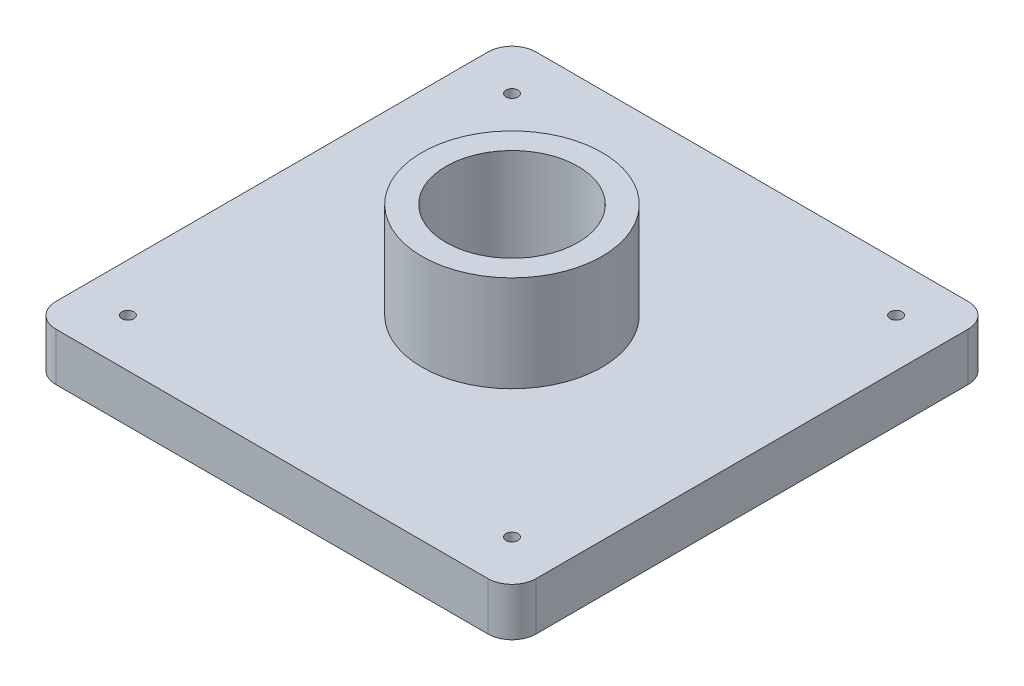
ISO-10303-21;
HEADER;
FILE_DESCRIPTION(('STEP AP214'),'2;1');
FILE_NAME('part.step','',(''),(''),'','','');
FILE_SCHEMA(('AUTOMOTIVE_DESIGN { 1 0 10303 214 1 1 1 1 }'));
ENDSEC;
DATA;
#1=APPLICATION_CONTEXT('core data for automotive mechanical design processes');
#2=APPLICATION_PROTOCOL_DEFINITION('international standard','automotive_design',2000,#1);
#3=PRODUCT_CONTEXT('',#1,'mechanical');
#4=PRODUCT('Part','Part','',(#3));
#5=PRODUCT_RELATED_PRODUCT_CATEGORY('part','',(#4));
#6=PRODUCT_DEFINITION_FORMATION('','',#4);
#7=PRODUCT_DEFINITION_CONTEXT('part definition',#1,'design');
#8=PRODUCT_DEFINITION('design','',#6,#7);
#9=PRODUCT_DEFINITION_SHAPE('','',#8);
#10=(LENGTH_UNIT() NAMED_UNIT(*) SI_UNIT(.MILLI.,.METRE.));
#11=(NAMED_UNIT(*) PLANE_ANGLE_UNIT() SI_UNIT($,.RADIAN.));
#12=(NAMED_UNIT(*) SI_UNIT($,.STERADIAN.) SOLID_ANGLE_UNIT());
#13=UNCERTAINTY_MEASURE_WITH_UNIT(LENGTH_MEASURE(1.E-05),#10,'distance_accuracy_value','');
#14=(GEOMETRIC_REPRESENTATION_CONTEXT(3) GLOBAL_UNCERTAINTY_ASSIGNED_CONTEXT((#13)) GLOBAL_UNIT_ASSIGNED_CONTEXT((#10,
#11,#12)) REPRESENTATION_CONTEXT('',''));
#15=CARTESIAN_POINT('',(0.,0.,0.));
#16=DIRECTION('',(0.,0.,1.));
#17=DIRECTION('',(1.,0.,0.));
#18=AXIS2_PLACEMENT_3D('',#15,#16,#17);
#19=CARTESIAN_POINT('',(-90.,20.,90.));
#20=DIRECTION('',(0.,-1.,0.));
#21=DIRECTION('',(0.,0.,-1.));
#22=AXIS2_PLACEMENT_3D('',#19,#20,#21);
#23=CYLINDRICAL_SURFACE('',#22,9.99999999999999);
#24=CARTESIAN_POINT('',(-90.,0.,90.));
#25=DIRECTION('',(0.,1.,0.));
#26=DIRECTION('',(0.,0.,-1.));
#27=AXIS2_PLACEMENT_3D('',#24,#25,#26);
#28=CIRCLE('',#27,9.99999999999999);
#29=CARTESIAN_POINT('',(-100.,0.,90.));
#30=VERTEX_POINT('',#29);
#31=CARTESIAN_POINT('',(-90.,0.,100.));
#32=VERTEX_POINT('',#31);
#33=EDGE_CURVE('E150',#30,#32,#28,.T.);
#34=ORIENTED_EDGE('',*,*,#33,.T.);
#35=DIRECTION('',(0.,-1.,0.));
#36=VECTOR('',#35,1.);
#37=CARTESIAN_POINT('',(-90.,20.,100.));
#38=LINE('',#37,#36);
#39=CARTESIAN_POINT('',(-90.,20.,100.));
#40=VERTEX_POINT('',#39);
#41=EDGE_CURVE('E51',#40,#32,#38,.T.);
#42=ORIENTED_EDGE('',*,*,#41,.F.);
#43=CARTESIAN_POINT('',(-90.,20.,90.));
#44=DIRECTION('',(0.,1.,0.));
#45=DIRECTION('',(0.,0.,-1.));
#46=AXIS2_PLACEMENT_3D('',#43,#44,#45);
#47=CIRCLE('',#46,9.99999999999999);
#48=CARTESIAN_POINT('',(-100.,20.,90.));
#49=VERTEX_POINT('',#48);
#50=EDGE_CURVE('E173',#49,#40,#47,.T.);
#51=ORIENTED_EDGE('',*,*,#50,.F.);
#52=DIRECTION('',(0.,-1.,0.));
#53=VECTOR('',#52,1.);
#54=CARTESIAN_POINT('',(-100.,20.,90.));
#55=LINE('',#54,#53);
#56=EDGE_CURVE('E146',#49,#30,#55,.T.);
#57=ORIENTED_EDGE('',*,*,#56,.T.);
#58=EDGE_LOOP('',(#34,#42,#51,#57));
#59=FACE_BOUND('',#58,.T.);
#60=ADVANCED_FACE('F48',(#59),#23,.T.);
#61=CARTESIAN_POINT('',(-90.,20.,100.));
#62=DIRECTION('',(0.,0.,-1.));
#63=DIRECTION('',(-1.,0.,0.));
#64=AXIS2_PLACEMENT_3D('',#61,#62,#63);
#65=PLANE('',#64);
#66=DIRECTION('',(1.,0.,0.));
#67=VECTOR('',#66,1.);
#68=CARTESIAN_POINT('',(-90.,0.,100.));
#69=LINE('',#68,#67);
#70=CARTESIAN_POINT('',(90.,0.,100.));
#71=VERTEX_POINT('',#70);
#72=EDGE_CURVE('E154',#32,#71,#69,.T.);
#73=ORIENTED_EDGE('',*,*,#72,.T.);
#74=DIRECTION('',(0.,-1.,0.));
#75=VECTOR('',#74,1.);
#76=CARTESIAN_POINT('',(90.,20.,100.));
#77=LINE('',#76,#75);
#78=CARTESIAN_POINT('',(90.,20.,100.));
#79=VERTEX_POINT('',#78);
#80=EDGE_CURVE('E187',#79,#71,#77,.T.);
#81=ORIENTED_EDGE('',*,*,#80,.F.);
#82=DIRECTION('',(1.,0.,0.));
#83=VECTOR('',#82,1.);
#84=CARTESIAN_POINT('',(-90.,20.,100.));
#85=LINE('',#84,#83);
#86=EDGE_CURVE('E109',#40,#79,#85,.T.);
#87=ORIENTED_EDGE('',*,*,#86,.F.);
#88=ORIENTED_EDGE('',*,*,#41,.T.);
#89=EDGE_LOOP('',(#73,#81,#87,#88));
#90=FACE_BOUND('',#89,.T.);
#91=ADVANCED_FACE('F196',(#90),#65,.F.);
#92=CARTESIAN_POINT('',(90.,20.,90.));
#93=DIRECTION('',(0.,-1.,0.));
#94=DIRECTION('',(0.,0.,-1.));
#95=AXIS2_PLACEMENT_3D('',#92,#93,#94);
#96=CYLINDRICAL_SURFACE('',#95,10.);
#97=CARTESIAN_POINT('',(90.,0.,90.));
#98=DIRECTION('',(0.,1.,0.));
#99=DIRECTION('',(0.,0.,1.));
#100=AXIS2_PLACEMENT_3D('',#97,#98,#99);
#101=CIRCLE('',#100,10.);
#102=CARTESIAN_POINT('',(100.,0.,90.));
#103=VERTEX_POINT('',#102);
#104=EDGE_CURVE('E158',#71,#103,#101,.T.);
#105=ORIENTED_EDGE('',*,*,#104,.T.);
#106=DIRECTION('',(0.,-1.,0.));
#107=VECTOR('',#106,1.);
#108=CARTESIAN_POINT('',(100.,20.,90.));
#109=LINE('',#108,#107);
#110=CARTESIAN_POINT('',(100.,20.,90.));
#111=VERTEX_POINT('',#110);
#112=EDGE_CURVE('E184',#111,#103,#109,.T.);
#113=ORIENTED_EDGE('',*,*,#112,.F.);
#114=CARTESIAN_POINT('',(90.,20.,90.));
#115=DIRECTION('',(0.,1.,0.));
#116=DIRECTION('',(0.,0.,1.));
#117=AXIS2_PLACEMENT_3D('',#114,#115,#116);
#118=CIRCLE('',#117,10.);
#119=EDGE_CURVE('E212',#79,#111,#118,.T.);
#120=ORIENTED_EDGE('',*,*,#119,.F.);
#121=ORIENTED_EDGE('',*,*,#80,.T.);
#122=EDGE_LOOP('',(#105,#113,#120,#121));
#123=FACE_BOUND('',#122,.T.);
#124=ADVANCED_FACE('F205',(#123),#96,.T.);
#125=CARTESIAN_POINT('',(100.,20.,90.));
#126=DIRECTION('',(-1.,0.,0.));
#127=DIRECTION('',(0.,0.,1.));
#128=AXIS2_PLACEMENT_3D('',#125,#126,#127);
#129=PLANE('',#128);
#130=DIRECTION('',(0.,0.,-1.));
#131=VECTOR('',#130,1.);
#132=CARTESIAN_POINT('',(100.,0.,90.));
#133=LINE('',#132,#131);
#134=CARTESIAN_POINT('',(100.,0.,-90.));
#135=VERTEX_POINT('',#134);
#136=EDGE_CURVE('E161',#103,#135,#133,.T.);
#137=ORIENTED_EDGE('',*,*,#136,.T.);
#138=DIRECTION('',(0.,-1.,0.));
#139=VECTOR('',#138,1.);
#140=CARTESIAN_POINT('',(100.,20.,-90.));
#141=LINE('',#140,#139);
#142=CARTESIAN_POINT('',(100.,20.,-90.));
#143=VERTEX_POINT('',#142);
#144=EDGE_CURVE('E180',#143,#135,#141,.T.);
#145=ORIENTED_EDGE('',*,*,#144,.F.);
#146=DIRECTION('',(0.,0.,-1.));
#147=VECTOR('',#146,1.);
#148=CARTESIAN_POINT('',(100.,20.,90.));
#149=LINE('',#148,#147);
#150=EDGE_CURVE('E210',#111,#143,#149,.T.);
#151=ORIENTED_EDGE('',*,*,#150,.F.);
#152=ORIENTED_EDGE('',*,*,#112,.T.);
#153=EDGE_LOOP('',(#137,#145,#151,#152));
#154=FACE_BOUND('',#153,.T.);
#155=ADVANCED_FACE('F208',(#154),#129,.F.);
#156=CARTESIAN_POINT('',(90.,20.,-90.));
#157=DIRECTION('',(0.,-1.,0.));
#158=DIRECTION('',(0.,0.,-1.));
#159=AXIS2_PLACEMENT_3D('',#156,#157,#158);
#160=CYLINDRICAL_SURFACE('',#159,10.);
#161=CARTESIAN_POINT('',(90.,0.,-90.));
#162=DIRECTION('',(0.,1.,0.));
#163=DIRECTION('',(0.,0.,-1.));
#164=AXIS2_PLACEMENT_3D('',#161,#162,#163);
#165=CIRCLE('',#164,10.);
#166=CARTESIAN_POINT('',(90.,0.,-100.));
#167=VERTEX_POINT('',#166);
#168=EDGE_CURVE('E164',#135,#167,#165,.T.);
#169=ORIENTED_EDGE('',*,*,#168,.T.);
#170=DIRECTION('',(0.,-1.,0.));
#171=VECTOR('',#170,1.);
#172=CARTESIAN_POINT('',(90.,20.,-100.));
#173=LINE('',#172,#171);
#174=CARTESIAN_POINT('',(90.,20.,-100.));
#175=VERTEX_POINT('',#174);
#176=EDGE_CURVE('E139',#175,#167,#173,.T.);
#177=ORIENTED_EDGE('',*,*,#176,.F.);
#178=CARTESIAN_POINT('',(90.,20.,-90.));
#179=DIRECTION('',(0.,1.,0.));
#180=DIRECTION('',(0.,0.,-1.));
#181=AXIS2_PLACEMENT_3D('',#178,#179,#180);
#182=CIRCLE('',#181,10.);
#183=EDGE_CURVE('E128',#143,#175,#182,.T.);
#184=ORIENTED_EDGE('',*,*,#183,.F.);
#185=ORIENTED_EDGE('',*,*,#144,.T.);
#186=EDGE_LOOP('',(#169,#177,#184,#185));
#187=FACE_BOUND('',#186,.T.);
#188=ADVANCED_FACE('F312',(#187),#160,.T.);
#189=CARTESIAN_POINT('',(-90.,20.,-100.));
#190=DIRECTION('',(0.,0.,1.));
#191=DIRECTION('',(1.,0.,0.));
#192=AXIS2_PLACEMENT_3D('',#189,#190,#191);
#193=PLANE('',#192);
#194=DIRECTION('',(-1.,0.,0.));
#195=VECTOR('',#194,1.);
#196=CARTESIAN_POINT('',(-90.,0.,-100.));
#197=LINE('',#196,#195);
#198=CARTESIAN_POINT('',(-90.,0.,-100.));
#199=VERTEX_POINT('',#198);
#200=EDGE_CURVE('E137',#167,#199,#197,.T.);
#201=ORIENTED_EDGE('',*,*,#200,.T.);
#202=DIRECTION('',(0.,-1.,0.));
#203=VECTOR('',#202,1.);
#204=CARTESIAN_POINT('',(-90.,20.,-100.));
#205=LINE('',#204,#203);
#206=CARTESIAN_POINT('',(-90.,20.,-100.));
#207=VERTEX_POINT('',#206);
#208=EDGE_CURVE('E134',#207,#199,#205,.T.);
#209=ORIENTED_EDGE('',*,*,#208,.F.);
#210=DIRECTION('',(-1.,0.,0.));
#211=VECTOR('',#210,1.);
#212=CARTESIAN_POINT('',(-90.,20.,-100.));
#213=LINE('',#212,#211);
#214=EDGE_CURVE('E122',#175,#207,#213,.T.);
#215=ORIENTED_EDGE('',*,*,#214,.F.);
#216=ORIENTED_EDGE('',*,*,#176,.T.);
#217=EDGE_LOOP('',(#201,#209,#215,#216));
#218=FACE_BOUND('',#217,.T.);
#219=ADVANCED_FACE('F135',(#218),#193,.F.);
#220=CARTESIAN_POINT('',(-90.,20.,-90.));
#221=DIRECTION('',(0.,-1.,0.));
#222=DIRECTION('',(0.,0.,-1.));
#223=AXIS2_PLACEMENT_3D('',#220,#221,#222);
#224=CYLINDRICAL_SURFACE('',#223,9.99999999999999);
#225=CARTESIAN_POINT('',(-90.,0.,-90.));
#226=DIRECTION('',(0.,1.,0.));
#227=DIRECTION('',(0.,0.,-1.));
#228=AXIS2_PLACEMENT_3D('',#225,#226,#227);
#229=CIRCLE('',#228,9.99999999999999);
#230=CARTESIAN_POINT('',(-100.,0.,-90.));
#231=VERTEX_POINT('',#230);
#232=EDGE_CURVE('E94',#199,#231,#229,.T.);
#233=ORIENTED_EDGE('',*,*,#232,.T.);
#234=DIRECTION('',(0.,-1.,0.));
#235=VECTOR('',#234,1.);
#236=CARTESIAN_POINT('',(-100.,20.,-90.));
#237=LINE('',#236,#235);
#238=CARTESIAN_POINT('',(-100.,20.,-90.));
#239=VERTEX_POINT('',#238);
#240=EDGE_CURVE('E140',#239,#231,#237,.T.);
#241=ORIENTED_EDGE('',*,*,#240,.F.);
#242=CARTESIAN_POINT('',(-90.,20.,-90.));
#243=DIRECTION('',(0.,1.,0.));
#244=DIRECTION('',(0.,0.,-1.));
#245=AXIS2_PLACEMENT_3D('',#242,#243,#244);
#246=CIRCLE('',#245,9.99999999999999);
#247=EDGE_CURVE('E126',#207,#239,#246,.T.);
#248=ORIENTED_EDGE('',*,*,#247,.F.);
#249=ORIENTED_EDGE('',*,*,#208,.T.);
#250=EDGE_LOOP('',(#233,#241,#248,#249));
#251=FACE_BOUND('',#250,.T.);
#252=ADVANCED_FACE('F142',(#251),#224,.T.);
#253=CARTESIAN_POINT('',(-100.,20.,90.));
#254=DIRECTION('',(1.,0.,0.));
#255=DIRECTION('',(0.,0.,-1.));
#256=AXIS2_PLACEMENT_3D('',#253,#254,#255);
#257=PLANE('',#256);
#258=DIRECTION('',(0.,0.,1.));
#259=VECTOR('',#258,1.);
#260=CARTESIAN_POINT('',(-100.,0.,90.));
#261=LINE('',#260,#259);
#262=EDGE_CURVE('E100',#231,#30,#261,.T.);
#263=ORIENTED_EDGE('',*,*,#262,.T.);
#264=ORIENTED_EDGE('',*,*,#56,.F.);
#265=DIRECTION('',(0.,0.,1.));
#266=VECTOR('',#265,1.);
#267=CARTESIAN_POINT('',(-100.,20.,90.));
#268=LINE('',#267,#266);
#269=EDGE_CURVE('E65',#239,#49,#268,.T.);
#270=ORIENTED_EDGE('',*,*,#269,.F.);
#271=ORIENTED_EDGE('',*,*,#240,.T.);
#272=EDGE_LOOP('',(#263,#264,#270,#271));
#273=FACE_BOUND('',#272,.T.);
#274=ADVANCED_FACE('F289',(#273),#257,.F.);
#275=CARTESIAN_POINT('',(-90.,20.,90.));
#276=DIRECTION('',(0.,-1.,0.));
#277=DIRECTION('',(0.,0.,-1.));
#278=AXIS2_PLACEMENT_3D('',#275,#276,#277);
#279=PLANE('',#278);
#280=CARTESIAN_POINT('',(-80.,20.,80.));
#281=DIRECTION('',(0.,1.,0.));
#282=DIRECTION('',(0.,0.,1.));
#283=AXIS2_PLACEMENT_3D('',#280,#281,#282);
#284=CIRCLE('',#283,2.50000000000001);
#285=CARTESIAN_POINT('',(-80.,20.,82.5));
#286=VERTEX_POINT('',#285);
#287=EDGE_CURVE('E234',#286,#286,#284,.T.);
#288=ORIENTED_EDGE('',*,*,#287,.F.);
#289=EDGE_LOOP('',(#288));
#290=FACE_BOUND('',#289,.T.);
#291=CARTESIAN_POINT('',(80.,20.,80.));
#292=DIRECTION('',(0.,1.,0.));
#293=DIRECTION('',(0.,0.,1.));
#294=AXIS2_PLACEMENT_3D('',#291,#292,#293);
#295=CIRCLE('',#294,2.5);
#296=CARTESIAN_POINT('',(80.,20.,82.5));
#297=VERTEX_POINT('',#296);
#298=EDGE_CURVE('E243',#297,#297,#295,.T.);
#299=ORIENTED_EDGE('',*,*,#298,.F.);
#300=EDGE_LOOP('',(#299));
#301=FACE_BOUND('',#300,.T.);
#302=CARTESIAN_POINT('',(80.,20.,-80.));
#303=DIRECTION('',(0.,1.,0.));
#304=DIRECTION('',(0.,0.,1.));
#305=AXIS2_PLACEMENT_3D('',#302,#303,#304);
#306=CIRCLE('',#305,2.5);
#307=CARTESIAN_POINT('',(80.,20.,-77.5));
#308=VERTEX_POINT('',#307);
#309=EDGE_CURVE('E251',#308,#308,#306,.T.);
#310=ORIENTED_EDGE('',*,*,#309,.F.);
#311=EDGE_LOOP('',(#310));
#312=FACE_BOUND('',#311,.T.);
#313=CARTESIAN_POINT('',(-80.,20.,-80.));
#314=DIRECTION('',(0.,1.,0.));
#315=DIRECTION('',(0.,0.,1.));
#316=AXIS2_PLACEMENT_3D('',#313,#314,#315);
#317=CIRCLE('',#316,2.50000000000001);
#318=CARTESIAN_POINT('',(-80.,20.,-77.5));
#319=VERTEX_POINT('',#318);
#320=EDGE_CURVE('E225',#319,#319,#317,.T.);
#321=ORIENTED_EDGE('',*,*,#320,.F.);
#322=EDGE_LOOP('',(#321));
#323=FACE_BOUND('',#322,.T.);
#324=CARTESIAN_POINT('',(0.,20.,0.));
#325=DIRECTION('',(0.,1.,0.));
#326=DIRECTION('',(0.,0.,1.));
#327=AXIS2_PLACEMENT_3D('',#324,#325,#326);
#328=CIRCLE('',#327,37.5);
#329=CARTESIAN_POINT('',(0.,20.,37.5));
#330=VERTEX_POINT('',#329);
#331=EDGE_CURVE('E12',#330,#330,#328,.T.);
#332=ORIENTED_EDGE('',*,*,#331,.F.);
#333=EDGE_LOOP('',(#332));
#334=FACE_BOUND('',#333,.T.);
#335=ORIENTED_EDGE('',*,*,#50,.T.);
#336=ORIENTED_EDGE('',*,*,#86,.T.);
#337=ORIENTED_EDGE('',*,*,#119,.T.);
#338=ORIENTED_EDGE('',*,*,#150,.T.);
#339=ORIENTED_EDGE('',*,*,#183,.T.);
#340=ORIENTED_EDGE('',*,*,#214,.T.);
#341=ORIENTED_EDGE('',*,*,#247,.T.);
#342=ORIENTED_EDGE('',*,*,#269,.T.);
#343=EDGE_LOOP('',(#335,#336,#337,#338,#339,#340,#341,#342));
#344=FACE_BOUND('',#343,.T.);
#345=ADVANCED_FACE('F124',(#290,#301,#312,#323,#334,#344),#279,.F.);
#346=CARTESIAN_POINT('',(-90.,0.,90.));
#347=DIRECTION('',(0.,-1.,0.));
#348=DIRECTION('',(0.,0.,-1.));
#349=AXIS2_PLACEMENT_3D('',#346,#347,#348);
#350=PLANE('',#349);
#351=CARTESIAN_POINT('',(0.,0.,0.));
#352=DIRECTION('',(0.,1.,0.));
#353=DIRECTION('',(0.,0.,1.));
#354=AXIS2_PLACEMENT_3D('',#351,#352,#353);
#355=CIRCLE('',#354,27.5);
#356=CARTESIAN_POINT('',(0.,0.,27.5));
#357=VERTEX_POINT('',#356);
#358=EDGE_CURVE('E239',#357,#357,#355,.T.);
#359=ORIENTED_EDGE('',*,*,#358,.T.);
#360=EDGE_LOOP('',(#359));
#361=FACE_BOUND('',#360,.T.);
#362=CARTESIAN_POINT('',(-80.,0.,80.));
#363=DIRECTION('',(0.,-1.,0.));
#364=DIRECTION('',(0.,0.,-1.));
#365=AXIS2_PLACEMENT_3D('',#362,#363,#364);
#366=CIRCLE('',#365,2.50000000000001);
#367=CARTESIAN_POINT('',(-80.,0.,77.5));
#368=VERTEX_POINT('',#367);
#369=EDGE_CURVE('E238',#368,#368,#366,.F.);
#370=ORIENTED_EDGE('',*,*,#369,.T.);
#371=EDGE_LOOP('',(#370));
#372=FACE_BOUND('',#371,.T.);
#373=CARTESIAN_POINT('',(80.,0.,80.));
#374=DIRECTION('',(0.,-1.,0.));
#375=DIRECTION('',(0.,0.,-1.));
#376=AXIS2_PLACEMENT_3D('',#373,#374,#375);
#377=CIRCLE('',#376,2.5);
#378=CARTESIAN_POINT('',(80.,0.,77.5));
#379=VERTEX_POINT('',#378);
#380=EDGE_CURVE('E247',#379,#379,#377,.F.);
#381=ORIENTED_EDGE('',*,*,#380,.T.);
#382=EDGE_LOOP('',(#381));
#383=FACE_BOUND('',#382,.T.);
#384=CARTESIAN_POINT('',(80.,0.,-80.));
#385=DIRECTION('',(0.,-1.,0.));
#386=DIRECTION('',(0.,0.,-1.));
#387=AXIS2_PLACEMENT_3D('',#384,#385,#386);
#388=CIRCLE('',#387,2.5);
#389=CARTESIAN_POINT('',(80.,0.,-82.5));
#390=VERTEX_POINT('',#389);
#391=EDGE_CURVE('E230',#390,#390,#388,.F.);
#392=ORIENTED_EDGE('',*,*,#391,.T.);
#393=EDGE_LOOP('',(#392));
#394=FACE_BOUND('',#393,.T.);
#395=CARTESIAN_POINT('',(-80.,0.,-80.));
#396=DIRECTION('',(0.,-1.,0.));
#397=DIRECTION('',(0.,0.,-1.));
#398=AXIS2_PLACEMENT_3D('',#395,#396,#397);
#399=CIRCLE('',#398,2.50000000000001);
#400=CARTESIAN_POINT('',(-80.,0.,-82.5));
#401=VERTEX_POINT('',#400);
#402=EDGE_CURVE('E226',#401,#401,#399,.F.);
#403=ORIENTED_EDGE('',*,*,#402,.T.);
#404=EDGE_LOOP('',(#403));
#405=FACE_BOUND('',#404,.T.);
#406=ORIENTED_EDGE('',*,*,#33,.F.);
#407=ORIENTED_EDGE('',*,*,#262,.F.);
#408=ORIENTED_EDGE('',*,*,#232,.F.);
#409=ORIENTED_EDGE('',*,*,#200,.F.);
#410=ORIENTED_EDGE('',*,*,#168,.F.);
#411=ORIENTED_EDGE('',*,*,#136,.F.);
#412=ORIENTED_EDGE('',*,*,#104,.F.);
#413=ORIENTED_EDGE('',*,*,#72,.F.);
#414=EDGE_LOOP('',(#406,#407,#408,#409,#410,#411,#412,#413));
#415=FACE_BOUND('',#414,.T.);
#416=ADVANCED_FACE('F201',(#361,#372,#383,#394,#405,#415),#350,.T.);
#417=CARTESIAN_POINT('',(0.,60.,0.));
#418=DIRECTION('',(0.,-1.,0.));
#419=DIRECTION('',(0.,0.,-1.));
#420=AXIS2_PLACEMENT_3D('',#417,#418,#419);
#421=CYLINDRICAL_SURFACE('',#420,37.5);
#422=CARTESIAN_POINT('',(0.,60.,0.));
#423=DIRECTION('',(0.,1.,0.));
#424=DIRECTION('',(0.,0.,1.));
#425=AXIS2_PLACEMENT_3D('',#422,#423,#424);
#426=CIRCLE('',#425,37.5);
#427=CARTESIAN_POINT('',(0.,60.,37.5));
#428=VERTEX_POINT('',#427);
#429=EDGE_CURVE('E155',#428,#428,#426,.T.);
#430=ORIENTED_EDGE('',*,*,#429,.F.);
#431=EDGE_LOOP('',(#430));
#432=FACE_BOUND('',#431,.T.);
#433=ORIENTED_EDGE('',*,*,#331,.T.);
#434=EDGE_LOOP('',(#433));
#435=FACE_BOUND('',#434,.T.);
#436=ADVANCED_FACE('F279',(#432,#435),#421,.T.);
#437=CARTESIAN_POINT('',(0.,60.,0.));
#438=DIRECTION('',(0.,1.,0.));
#439=DIRECTION('',(0.,0.,1.));
#440=AXIS2_PLACEMENT_3D('',#437,#438,#439);
#441=PLANE('',#440);
#442=CARTESIAN_POINT('',(0.,60.,0.));
#443=DIRECTION('',(0.,1.,0.));
#444=DIRECTION('',(0.,0.,1.));
#445=AXIS2_PLACEMENT_3D('',#442,#443,#444);
#446=CIRCLE('',#445,27.5);
#447=CARTESIAN_POINT('',(0.,60.,27.5));
#448=VERTEX_POINT('',#447);
#449=EDGE_CURVE('E258',#448,#448,#446,.T.);
#450=ORIENTED_EDGE('',*,*,#449,.F.);
#451=EDGE_LOOP('',(#450));
#452=FACE_BOUND('',#451,.T.);
#453=ORIENTED_EDGE('',*,*,#429,.T.);
#454=EDGE_LOOP('',(#453));
#455=FACE_BOUND('',#454,.T.);
#456=ADVANCED_FACE('F275',(#452,#455),#441,.T.);
#457=CARTESIAN_POINT('',(-80.,-0.001000000000001,-80.));
#458=DIRECTION('',(0.,1.,0.));
#459=DIRECTION('',(0.,0.,1.));
#460=AXIS2_PLACEMENT_3D('',#457,#458,#459);
#461=CYLINDRICAL_SURFACE('',#460,2.50000000000001);
#462=ORIENTED_EDGE('',*,*,#402,.F.);
#463=EDGE_LOOP('',(#462));
#464=FACE_BOUND('',#463,.T.);
#465=ORIENTED_EDGE('',*,*,#320,.T.);
#466=EDGE_LOOP('',(#465));
#467=FACE_BOUND('',#466,.T.);
#468=ADVANCED_FACE('F278',(#464,#467),#461,.F.);
#469=CARTESIAN_POINT('',(80.,-0.001000000000001,-80.));
#470=DIRECTION('',(0.,1.,0.));
#471=DIRECTION('',(0.,0.,1.));
#472=AXIS2_PLACEMENT_3D('',#469,#470,#471);
#473=CYLINDRICAL_SURFACE('',#472,2.5);
#474=ORIENTED_EDGE('',*,*,#391,.F.);
#475=EDGE_LOOP('',(#474));
#476=FACE_BOUND('',#475,.T.);
#477=ORIENTED_EDGE('',*,*,#309,.T.);
#478=EDGE_LOOP('',(#477));
#479=FACE_BOUND('',#478,.T.);
#480=ADVANCED_FACE('F353',(#476,#479),#473,.F.);
#481=CARTESIAN_POINT('',(80.,-0.001000000000001,80.));
#482=DIRECTION('',(0.,1.,0.));
#483=DIRECTION('',(0.,0.,1.));
#484=AXIS2_PLACEMENT_3D('',#481,#482,#483);
#485=CYLINDRICAL_SURFACE('',#484,2.5);
#486=ORIENTED_EDGE('',*,*,#380,.F.);
#487=EDGE_LOOP('',(#486));
#488=FACE_BOUND('',#487,.T.);
#489=ORIENTED_EDGE('',*,*,#298,.T.);
#490=EDGE_LOOP('',(#489));
#491=FACE_BOUND('',#490,.T.);
#492=ADVANCED_FACE('F364',(#488,#491),#485,.F.);
#493=CARTESIAN_POINT('',(-80.,-0.001000000000001,80.));
#494=DIRECTION('',(0.,1.,0.));
#495=DIRECTION('',(0.,0.,1.));
#496=AXIS2_PLACEMENT_3D('',#493,#494,#495);
#497=CYLINDRICAL_SURFACE('',#496,2.50000000000001);
#498=ORIENTED_EDGE('',*,*,#369,.F.);
#499=EDGE_LOOP('',(#498));
#500=FACE_BOUND('',#499,.T.);
#501=ORIENTED_EDGE('',*,*,#287,.T.);
#502=EDGE_LOOP('',(#501));
#503=FACE_BOUND('',#502,.T.);
#504=ADVANCED_FACE('F271',(#500,#503),#497,.F.);
#505=CARTESIAN_POINT('',(0.,0.,0.));
#506=DIRECTION('',(0.,1.,0.));
#507=DIRECTION('',(0.,0.,1.));
#508=AXIS2_PLACEMENT_3D('',#505,#506,#507);
#509=CYLINDRICAL_SURFACE('',#508,27.5);
#510=ORIENTED_EDGE('',*,*,#358,.F.);
#511=EDGE_LOOP('',(#510));
#512=FACE_BOUND('',#511,.T.);
#513=ORIENTED_EDGE('',*,*,#449,.T.);
#514=EDGE_LOOP('',(#513));
#515=FACE_BOUND('',#514,.T.);
#516=ADVANCED_FACE('F268',(#512,#515),#509,.F.);
#517=CLOSED_SHELL('',(#60,#91,#124,#155,#188,#219,#252,#274,#345,#416,#436,#456,#468,#480,#492,
#504,#516));
#518=MANIFOLD_SOLID_BREP('B2',#517);
#519=ADVANCED_BREP_SHAPE_REPRESENTATION('',(#18,#518),#14);
#520=SHAPE_DEFINITION_REPRESENTATION(#9,#519);
ENDSEC;
END-ISO-10303-21;
